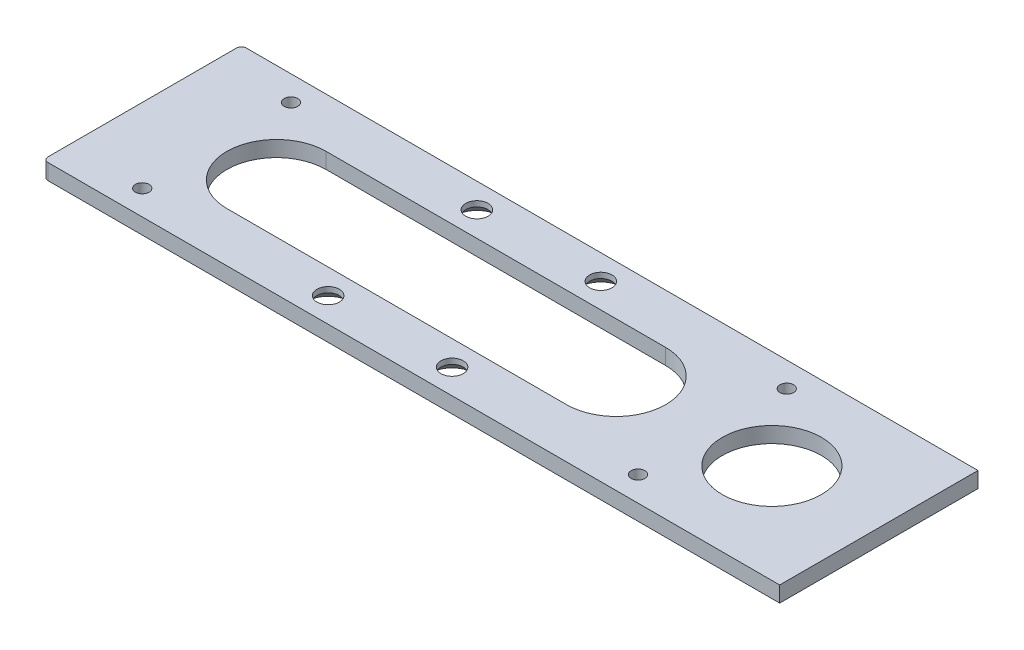
ISO-10303-21;
HEADER;
FILE_DESCRIPTION(('STEP AP214'),'2;1');
FILE_NAME('part.step','',(''),(''),'','','');
FILE_SCHEMA(('AUTOMOTIVE_DESIGN { 1 0 10303 214 1 1 1 1 }'));
ENDSEC;
DATA;
#1=APPLICATION_CONTEXT('core data for automotive mechanical design processes');
#2=APPLICATION_PROTOCOL_DEFINITION('international standard','automotive_design',2000,#1);
#3=PRODUCT_CONTEXT('',#1,'mechanical');
#4=PRODUCT('Part','Part','',(#3));
#5=PRODUCT_RELATED_PRODUCT_CATEGORY('part','',(#4));
#6=PRODUCT_DEFINITION_FORMATION('','',#4);
#7=PRODUCT_DEFINITION_CONTEXT('part definition',#1,'design');
#8=PRODUCT_DEFINITION('design','',#6,#7);
#9=PRODUCT_DEFINITION_SHAPE('','',#8);
#10=(LENGTH_UNIT() NAMED_UNIT(*) SI_UNIT(.MILLI.,.METRE.));
#11=(NAMED_UNIT(*) PLANE_ANGLE_UNIT() SI_UNIT($,.RADIAN.));
#12=(NAMED_UNIT(*) SI_UNIT($,.STERADIAN.) SOLID_ANGLE_UNIT());
#13=UNCERTAINTY_MEASURE_WITH_UNIT(LENGTH_MEASURE(1.E-05),#10,'distance_accuracy_value','');
#14=(GEOMETRIC_REPRESENTATION_CONTEXT(3) GLOBAL_UNCERTAINTY_ASSIGNED_CONTEXT((#13)) GLOBAL_UNIT_ASSIGNED_CONTEXT((#10,
#11,#12)) REPRESENTATION_CONTEXT('',''));
#15=CARTESIAN_POINT('',(0.,0.,0.));
#16=DIRECTION('',(0.,0.,1.));
#17=DIRECTION('',(1.,0.,0.));
#18=AXIS2_PLACEMENT_3D('',#15,#16,#17);
#19=CARTESIAN_POINT('',(0.,0.,0.));
#20=DIRECTION('',(0.,1.,0.));
#21=DIRECTION('',(0.,0.,1.));
#22=AXIS2_PLACEMENT_3D('',#19,#20,#21);
#23=PLANE('',#22);
#24=CARTESIAN_POINT('',(-44.7777777777778,0.,35.5555555555555));
#25=DIRECTION('',(0.,1.,0.));
#26=DIRECTION('',(0.,0.,1.));
#27=AXIS2_PLACEMENT_3D('',#24,#25,#26);
#28=CIRCLE('',#27,4.5);
#29=CARTESIAN_POINT('',(-44.7777777777778,0.,40.0555555555555));
#30=VERTEX_POINT('',#29);
#31=EDGE_CURVE('E230',#30,#30,#28,.F.);
#32=ORIENTED_EDGE('',*,*,#31,.T.);
#33=EDGE_LOOP('',(#32));
#34=FACE_BOUND('',#33,.T.);
#35=CARTESIAN_POINT('',(41.3891053094915,0.,5.55555555555554));
#36=DIRECTION('',(0.,1.,0.));
#37=DIRECTION('',(0.,0.,1.));
#38=AXIS2_PLACEMENT_3D('',#35,#36,#37);
#39=CIRCLE('',#38,20.);
#40=CARTESIAN_POINT('',(41.3891053094915,0.,25.5555555555556));
#41=VERTEX_POINT('',#40);
#42=CARTESIAN_POINT('',(41.3891053094915,0.,-14.4444444444445));
#43=VERTEX_POINT('',#42);
#44=EDGE_CURVE('E11',#41,#43,#39,.T.);
#45=ORIENTED_EDGE('',*,*,#44,.F.);
#46=DIRECTION('',(1.,0.,0.));
#47=VECTOR('',#46,1.);
#48=CARTESIAN_POINT('',(0.,0.,25.5555555555556));
#49=LINE('',#48,#47);
#50=CARTESIAN_POINT('',(-95.6280935052405,0.,25.5555555555556));
#51=VERTEX_POINT('',#50);
#52=EDGE_CURVE('E215',#51,#41,#49,.T.);
#53=ORIENTED_EDGE('',*,*,#52,.F.);
#54=CARTESIAN_POINT('',(-95.6280935052405,0.,5.55555555555556));
#55=DIRECTION('',(0.,1.,0.));
#56=DIRECTION('',(0.,0.,1.));
#57=AXIS2_PLACEMENT_3D('',#54,#55,#56);
#58=CIRCLE('',#57,20.);
#59=CARTESIAN_POINT('',(-95.6280935052405,0.,-14.4444444444445));
#60=VERTEX_POINT('',#59);
#61=EDGE_CURVE('E219',#60,#51,#58,.T.);
#62=ORIENTED_EDGE('',*,*,#61,.F.);
#63=DIRECTION('',(1.,0.,0.));
#64=VECTOR('',#63,1.);
#65=CARTESIAN_POINT('',(0.,0.,-14.4444444444445));
#66=LINE('',#65,#64);
#67=EDGE_CURVE('E48',#60,#43,#66,.T.);
#68=ORIENTED_EDGE('',*,*,#67,.T.);
#69=EDGE_LOOP('',(#45,#53,#62,#68));
#70=FACE_BOUND('',#69,.T.);
#71=CARTESIAN_POINT('',(104.209895864074,0.,5.55555555555554));
#72=DIRECTION('',(0.,1.,0.));
#73=DIRECTION('',(0.,0.,1.));
#74=AXIS2_PLACEMENT_3D('',#71,#72,#73);
#75=CIRCLE('',#74,20.);
#76=CARTESIAN_POINT('',(104.209895864074,0.,25.5555555555555));
#77=VERTEX_POINT('',#76);
#78=EDGE_CURVE('E141',#77,#77,#75,.T.);
#79=ORIENTED_EDGE('',*,*,#78,.F.);
#80=EDGE_LOOP('',(#79));
#81=FACE_BOUND('',#80,.T.);
#82=CARTESIAN_POINT('',(-119.777777777778,0.,-24.4444444444445));
#83=DIRECTION('',(0.,1.,0.));
#84=DIRECTION('',(0.,0.,1.));
#85=AXIS2_PLACEMENT_3D('',#82,#83,#84);
#86=CIRCLE('',#85,2.75);
#87=CARTESIAN_POINT('',(-119.777777777778,0.,-21.6944444444445));
#88=VERTEX_POINT('',#87);
#89=EDGE_CURVE('E146',#88,#88,#86,.T.);
#90=ORIENTED_EDGE('',*,*,#89,.F.);
#91=EDGE_LOOP('',(#90));
#92=FACE_BOUND('',#91,.T.);
#93=CARTESIAN_POINT('',(-119.777777777778,0.,35.5555555555555));
#94=DIRECTION('',(0.,1.,0.));
#95=DIRECTION('',(0.,0.,1.));
#96=AXIS2_PLACEMENT_3D('',#93,#94,#95);
#97=CIRCLE('',#96,2.75);
#98=CARTESIAN_POINT('',(-119.777777777778,0.,38.3055555555555));
#99=VERTEX_POINT('',#98);
#100=EDGE_CURVE('E152',#99,#99,#97,.T.);
#101=ORIENTED_EDGE('',*,*,#100,.F.);
#102=EDGE_LOOP('',(#101));
#103=FACE_BOUND('',#102,.T.);
#104=CARTESIAN_POINT('',(80.2222222222222,0.,35.5555555555555));
#105=DIRECTION('',(0.,1.,0.));
#106=DIRECTION('',(0.,0.,1.));
#107=AXIS2_PLACEMENT_3D('',#104,#105,#106);
#108=CIRCLE('',#107,2.75);
#109=CARTESIAN_POINT('',(80.2222222222222,0.,38.3055555555555));
#110=VERTEX_POINT('',#109);
#111=EDGE_CURVE('E158',#110,#110,#108,.T.);
#112=ORIENTED_EDGE('',*,*,#111,.F.);
#113=EDGE_LOOP('',(#112));
#114=FACE_BOUND('',#113,.T.);
#115=CARTESIAN_POINT('',(80.2222222222222,0.,-24.4444444444445));
#116=DIRECTION('',(0.,1.,0.));
#117=DIRECTION('',(0.,0.,1.));
#118=AXIS2_PLACEMENT_3D('',#115,#116,#117);
#119=CIRCLE('',#118,2.75);
#120=CARTESIAN_POINT('',(80.2222222222222,0.,-21.6944444444445));
#121=VERTEX_POINT('',#120);
#122=EDGE_CURVE('E164',#121,#121,#119,.T.);
#123=ORIENTED_EDGE('',*,*,#122,.F.);
#124=EDGE_LOOP('',(#123));
#125=FACE_BOUND('',#124,.T.);
#126=DIRECTION('',(-1.,0.,0.));
#127=VECTOR('',#126,1.);
#128=CARTESIAN_POINT('',(-149.777777777778,0.,-34.4444444444445));
#129=LINE('',#128,#127);
#130=CARTESIAN_POINT('',(147.372222222222,0.,-34.4444444444445));
#131=VERTEX_POINT('',#130);
#132=CARTESIAN_POINT('',(-147.777777777778,0.,-34.4444444444445));
#133=VERTEX_POINT('',#132);
#134=EDGE_CURVE('E175',#131,#133,#129,.T.);
#135=ORIENTED_EDGE('',*,*,#134,.T.);
#136=CARTESIAN_POINT('',(-147.777777777778,0.,-32.4444444444445));
#137=DIRECTION('',(0.,1.,0.));
#138=DIRECTION('',(0.,0.,1.));
#139=AXIS2_PLACEMENT_3D('',#136,#137,#138);
#140=CIRCLE('',#139,2.);
#141=CARTESIAN_POINT('',(-149.777777777778,0.,-32.4444444444445));
#142=VERTEX_POINT('',#141);
#143=EDGE_CURVE('E202',#133,#142,#140,.T.);
#144=ORIENTED_EDGE('',*,*,#143,.T.);
#145=DIRECTION('',(0.,0.,1.));
#146=VECTOR('',#145,1.);
#147=CARTESIAN_POINT('',(-149.777777777778,0.,-34.4444444444445));
#148=LINE('',#147,#146);
#149=CARTESIAN_POINT('',(-149.777777777778,0.,43.5555555555555));
#150=VERTEX_POINT('',#149);
#151=EDGE_CURVE('E170',#142,#150,#148,.T.);
#152=ORIENTED_EDGE('',*,*,#151,.T.);
#153=CARTESIAN_POINT('',(-147.777777777778,0.,43.5555555555555));
#154=DIRECTION('',(0.,1.,0.));
#155=DIRECTION('',(0.,0.,1.));
#156=AXIS2_PLACEMENT_3D('',#153,#154,#155);
#157=CIRCLE('',#156,2.);
#158=CARTESIAN_POINT('',(-147.777777777778,0.,45.5555555555555));
#159=VERTEX_POINT('',#158);
#160=EDGE_CURVE('E200',#150,#159,#157,.T.);
#161=ORIENTED_EDGE('',*,*,#160,.T.);
#162=DIRECTION('',(1.,0.,0.));
#163=VECTOR('',#162,1.);
#164=CARTESIAN_POINT('',(-149.777777777778,0.,45.5555555555555));
#165=LINE('',#164,#163);
#166=CARTESIAN_POINT('',(147.372222222222,0.,45.5555555555555));
#167=VERTEX_POINT('',#166);
#168=EDGE_CURVE('E186',#159,#167,#165,.T.);
#169=ORIENTED_EDGE('',*,*,#168,.T.);
#170=DIRECTION('',(0.,0.,-1.));
#171=VECTOR('',#170,1.);
#172=CARTESIAN_POINT('',(147.372222222222,0.,-34.4444444444445));
#173=LINE('',#172,#171);
#174=EDGE_CURVE('E188',#167,#131,#173,.T.);
#175=ORIENTED_EDGE('',*,*,#174,.T.);
#176=EDGE_LOOP('',(#135,#144,#152,#161,#169,#175));
#177=FACE_BOUND('',#176,.T.);
#178=CARTESIAN_POINT('',(5.22222222222219,0.,35.5555555555555));
#179=DIRECTION('',(0.,1.,0.));
#180=DIRECTION('',(0.,0.,1.));
#181=AXIS2_PLACEMENT_3D('',#178,#179,#180);
#182=CIRCLE('',#181,4.5);
#183=CARTESIAN_POINT('',(5.22222222222219,0.,40.0555555555555));
#184=VERTEX_POINT('',#183);
#185=EDGE_CURVE('E239',#184,#184,#182,.F.);
#186=ORIENTED_EDGE('',*,*,#185,.T.);
#187=EDGE_LOOP('',(#186));
#188=FACE_BOUND('',#187,.T.);
#189=CARTESIAN_POINT('',(5.22222222222225,0.,-24.4444444444445));
#190=DIRECTION('',(0.,1.,0.));
#191=DIRECTION('',(0.,0.,1.));
#192=AXIS2_PLACEMENT_3D('',#189,#190,#191);
#193=CIRCLE('',#192,4.5);
#194=CARTESIAN_POINT('',(5.22222222222225,0.,-19.9444444444445));
#195=VERTEX_POINT('',#194);
#196=EDGE_CURVE('E248',#195,#195,#193,.F.);
#197=ORIENTED_EDGE('',*,*,#196,.T.);
#198=EDGE_LOOP('',(#197));
#199=FACE_BOUND('',#198,.T.);
#200=CARTESIAN_POINT('',(-44.7777777777778,0.,-24.4444444444444));
#201=DIRECTION('',(0.,1.,0.));
#202=DIRECTION('',(0.,0.,1.));
#203=AXIS2_PLACEMENT_3D('',#200,#201,#202);
#204=CIRCLE('',#203,4.5);
#205=CARTESIAN_POINT('',(-44.7777777777778,0.,-19.9444444444445));
#206=VERTEX_POINT('',#205);
#207=EDGE_CURVE('E257',#206,#206,#204,.F.);
#208=ORIENTED_EDGE('',*,*,#207,.T.);
#209=EDGE_LOOP('',(#208));
#210=FACE_BOUND('',#209,.T.);
#211=ADVANCED_FACE('F40',(#34,#70,#81,#92,#103,#114,#125,#177,#188,#199,#210),#23,.T.);
#212=CARTESIAN_POINT('',(0.,-6.35,0.));
#213=DIRECTION('',(0.,1.,0.));
#214=DIRECTION('',(0.,0.,1.));
#215=AXIS2_PLACEMENT_3D('',#212,#213,#214);
#216=PLANE('',#215);
#217=CARTESIAN_POINT('',(-44.7777777777778,-6.35,-24.4444444444444));
#218=DIRECTION('',(0.,-1.,0.));
#219=DIRECTION('',(0.,0.,-1.));
#220=AXIS2_PLACEMENT_3D('',#217,#218,#219);
#221=CIRCLE('',#220,8.65);
#222=CARTESIAN_POINT('',(-44.7777777777778,-6.35,-33.0944444444444));
#223=VERTEX_POINT('',#222);
#224=EDGE_CURVE('E260',#223,#223,#221,.T.);
#225=ORIENTED_EDGE('',*,*,#224,.F.);
#226=EDGE_LOOP('',(#225));
#227=FACE_BOUND('',#226,.T.);
#228=CARTESIAN_POINT('',(5.22222222222225,-6.35,-24.4444444444445));
#229=DIRECTION('',(0.,-1.,0.));
#230=DIRECTION('',(0.,0.,-1.));
#231=AXIS2_PLACEMENT_3D('',#228,#229,#230);
#232=CIRCLE('',#231,8.65);
#233=CARTESIAN_POINT('',(5.22222222222225,-6.35,-33.0944444444445));
#234=VERTEX_POINT('',#233);
#235=EDGE_CURVE('E251',#234,#234,#232,.T.);
#236=ORIENTED_EDGE('',*,*,#235,.F.);
#237=EDGE_LOOP('',(#236));
#238=FACE_BOUND('',#237,.T.);
#239=CARTESIAN_POINT('',(5.22222222222219,-6.35,35.5555555555555));
#240=DIRECTION('',(0.,-1.,0.));
#241=DIRECTION('',(0.,0.,-1.));
#242=AXIS2_PLACEMENT_3D('',#239,#240,#241);
#243=CIRCLE('',#242,8.65);
#244=CARTESIAN_POINT('',(5.22222222222219,-6.35,26.9055555555555));
#245=VERTEX_POINT('',#244);
#246=EDGE_CURVE('E242',#245,#245,#243,.T.);
#247=ORIENTED_EDGE('',*,*,#246,.F.);
#248=EDGE_LOOP('',(#247));
#249=FACE_BOUND('',#248,.T.);
#250=DIRECTION('',(-1.,0.,0.));
#251=VECTOR('',#250,1.);
#252=CARTESIAN_POINT('',(41.3891053094915,-6.35,25.5555555555556));
#253=LINE('',#252,#251);
#254=CARTESIAN_POINT('',(41.3891053094915,-6.35,25.5555555555556));
#255=VERTEX_POINT('',#254);
#256=CARTESIAN_POINT('',(-95.6280935052405,-6.35,25.5555555555556));
#257=VERTEX_POINT('',#256);
#258=EDGE_CURVE('E137',#255,#257,#253,.T.);
#259=ORIENTED_EDGE('',*,*,#258,.F.);
#260=CARTESIAN_POINT('',(41.3891053094915,-6.35,5.55555555555554));
#261=DIRECTION('',(0.,-1.,0.));
#262=DIRECTION('',(0.,0.,-1.));
#263=AXIS2_PLACEMENT_3D('',#260,#261,#262);
#264=CIRCLE('',#263,20.);
#265=CARTESIAN_POINT('',(41.3891053094915,-6.35,-14.4444444444445));
#266=VERTEX_POINT('',#265);
#267=EDGE_CURVE('E55',#266,#255,#264,.T.);
#268=ORIENTED_EDGE('',*,*,#267,.F.);
#269=DIRECTION('',(-1.,0.,0.));
#270=VECTOR('',#269,1.);
#271=CARTESIAN_POINT('',(41.3891053094915,-6.35,-14.4444444444445));
#272=LINE('',#271,#270);
#273=CARTESIAN_POINT('',(-95.6280935052405,-6.35,-14.4444444444445));
#274=VERTEX_POINT('',#273);
#275=EDGE_CURVE('E125',#266,#274,#272,.T.);
#276=ORIENTED_EDGE('',*,*,#275,.T.);
#277=CARTESIAN_POINT('',(-95.6280935052405,-6.35,5.55555555555556));
#278=DIRECTION('',(0.,-1.,0.));
#279=DIRECTION('',(0.,0.,-1.));
#280=AXIS2_PLACEMENT_3D('',#277,#278,#279);
#281=CIRCLE('',#280,20.);
#282=EDGE_CURVE('E131',#257,#274,#281,.T.);
#283=ORIENTED_EDGE('',*,*,#282,.F.);
#284=EDGE_LOOP('',(#259,#268,#276,#283));
#285=FACE_BOUND('',#284,.T.);
#286=CARTESIAN_POINT('',(104.209895864074,-6.35,5.55555555555554));
#287=DIRECTION('',(0.,-1.,0.));
#288=DIRECTION('',(0.,0.,-1.));
#289=AXIS2_PLACEMENT_3D('',#286,#287,#288);
#290=CIRCLE('',#289,20.);
#291=CARTESIAN_POINT('',(104.209895864074,-6.35,-14.4444444444445));
#292=VERTEX_POINT('',#291);
#293=EDGE_CURVE('E138',#292,#292,#290,.T.);
#294=ORIENTED_EDGE('',*,*,#293,.F.);
#295=EDGE_LOOP('',(#294));
#296=FACE_BOUND('',#295,.T.);
#297=CARTESIAN_POINT('',(-119.777777777778,-6.35,-24.4444444444445));
#298=DIRECTION('',(0.,1.,0.));
#299=DIRECTION('',(0.,0.,1.));
#300=AXIS2_PLACEMENT_3D('',#297,#298,#299);
#301=CIRCLE('',#300,2.75);
#302=CARTESIAN_POINT('',(-119.777777777778,-6.35,-21.6944444444445));
#303=VERTEX_POINT('',#302);
#304=EDGE_CURVE('E149',#303,#303,#301,.T.);
#305=ORIENTED_EDGE('',*,*,#304,.T.);
#306=EDGE_LOOP('',(#305));
#307=FACE_BOUND('',#306,.T.);
#308=CARTESIAN_POINT('',(-119.777777777778,-6.35,35.5555555555555));
#309=DIRECTION('',(0.,1.,0.));
#310=DIRECTION('',(0.,0.,1.));
#311=AXIS2_PLACEMENT_3D('',#308,#309,#310);
#312=CIRCLE('',#311,2.75);
#313=CARTESIAN_POINT('',(-119.777777777778,-6.35,38.3055555555555));
#314=VERTEX_POINT('',#313);
#315=EDGE_CURVE('E155',#314,#314,#312,.T.);
#316=ORIENTED_EDGE('',*,*,#315,.T.);
#317=EDGE_LOOP('',(#316));
#318=FACE_BOUND('',#317,.T.);
#319=CARTESIAN_POINT('',(80.2222222222222,-6.35,35.5555555555555));
#320=DIRECTION('',(0.,1.,0.));
#321=DIRECTION('',(0.,0.,1.));
#322=AXIS2_PLACEMENT_3D('',#319,#320,#321);
#323=CIRCLE('',#322,2.75);
#324=CARTESIAN_POINT('',(80.2222222222222,-6.35,38.3055555555555));
#325=VERTEX_POINT('',#324);
#326=EDGE_CURVE('E161',#325,#325,#323,.T.);
#327=ORIENTED_EDGE('',*,*,#326,.T.);
#328=EDGE_LOOP('',(#327));
#329=FACE_BOUND('',#328,.T.);
#330=CARTESIAN_POINT('',(80.2222222222222,-6.35,-24.4444444444445));
#331=DIRECTION('',(0.,1.,0.));
#332=DIRECTION('',(0.,0.,1.));
#333=AXIS2_PLACEMENT_3D('',#330,#331,#332);
#334=CIRCLE('',#333,2.75);
#335=CARTESIAN_POINT('',(80.2222222222222,-6.35,-21.6944444444445));
#336=VERTEX_POINT('',#335);
#337=EDGE_CURVE('E167',#336,#336,#334,.T.);
#338=ORIENTED_EDGE('',*,*,#337,.T.);
#339=EDGE_LOOP('',(#338));
#340=FACE_BOUND('',#339,.T.);
#341=DIRECTION('',(0.,0.,1.));
#342=VECTOR('',#341,1.);
#343=CARTESIAN_POINT('',(-149.777777777778,-6.35,-34.4444444444445));
#344=LINE('',#343,#342);
#345=CARTESIAN_POINT('',(-149.777777777778,-6.35,-32.4444444444445));
#346=VERTEX_POINT('',#345);
#347=CARTESIAN_POINT('',(-149.777777777778,-6.35,43.5555555555555));
#348=VERTEX_POINT('',#347);
#349=EDGE_CURVE('E171',#346,#348,#344,.T.);
#350=ORIENTED_EDGE('',*,*,#349,.F.);
#351=CARTESIAN_POINT('',(-147.777777777778,-6.35,-32.4444444444445));
#352=DIRECTION('',(0.,1.,0.));
#353=DIRECTION('',(0.,0.,1.));
#354=AXIS2_PLACEMENT_3D('',#351,#352,#353);
#355=CIRCLE('',#354,2.);
#356=CARTESIAN_POINT('',(-147.777777777778,-6.35,-34.4444444444445));
#357=VERTEX_POINT('',#356);
#358=EDGE_CURVE('E211',#346,#357,#355,.F.);
#359=ORIENTED_EDGE('',*,*,#358,.T.);
#360=DIRECTION('',(-1.,0.,0.));
#361=VECTOR('',#360,1.);
#362=CARTESIAN_POINT('',(-149.777777777778,-6.35,-34.4444444444445));
#363=LINE('',#362,#361);
#364=CARTESIAN_POINT('',(147.372222222222,-6.35,-34.4444444444445));
#365=VERTEX_POINT('',#364);
#366=EDGE_CURVE('E180',#365,#357,#363,.T.);
#367=ORIENTED_EDGE('',*,*,#366,.F.);
#368=DIRECTION('',(0.,0.,-1.));
#369=VECTOR('',#368,1.);
#370=CARTESIAN_POINT('',(147.372222222222,-6.35,-34.4444444444445));
#371=LINE('',#370,#369);
#372=CARTESIAN_POINT('',(147.372222222222,-6.35,45.5555555555555));
#373=VERTEX_POINT('',#372);
#374=EDGE_CURVE('E177',#373,#365,#371,.T.);
#375=ORIENTED_EDGE('',*,*,#374,.F.);
#376=DIRECTION('',(1.,0.,0.));
#377=VECTOR('',#376,1.);
#378=CARTESIAN_POINT('',(-149.777777777778,-6.35,45.5555555555555));
#379=LINE('',#378,#377);
#380=CARTESIAN_POINT('',(-147.777777777778,-6.35,45.5555555555555));
#381=VERTEX_POINT('',#380);
#382=EDGE_CURVE('E174',#381,#373,#379,.T.);
#383=ORIENTED_EDGE('',*,*,#382,.F.);
#384=CARTESIAN_POINT('',(-147.777777777778,-6.35,43.5555555555555));
#385=DIRECTION('',(0.,1.,0.));
#386=DIRECTION('',(0.,0.,1.));
#387=AXIS2_PLACEMENT_3D('',#384,#385,#386);
#388=CIRCLE('',#387,2.);
#389=EDGE_CURVE('E209',#381,#348,#388,.F.);
#390=ORIENTED_EDGE('',*,*,#389,.T.);
#391=EDGE_LOOP('',(#350,#359,#367,#375,#383,#390));
#392=FACE_BOUND('',#391,.T.);
#393=CARTESIAN_POINT('',(-44.7777777777778,-6.35,35.5555555555555));
#394=DIRECTION('',(0.,-1.,0.));
#395=DIRECTION('',(0.,0.,-1.));
#396=AXIS2_PLACEMENT_3D('',#393,#394,#395);
#397=CIRCLE('',#396,8.65);
#398=CARTESIAN_POINT('',(-44.7777777777778,-6.35,26.9055555555555));
#399=VERTEX_POINT('',#398);
#400=EDGE_CURVE('E233',#399,#399,#397,.T.);
#401=ORIENTED_EDGE('',*,*,#400,.F.);
#402=EDGE_LOOP('',(#401));
#403=FACE_BOUND('',#402,.T.);
#404=ADVANCED_FACE('F135',(#227,#238,#249,#285,#296,#307,#318,#329,#340,#392,#403),#216,.F.);
#405=CARTESIAN_POINT('',(-149.777777777778,-6.35,-34.4444444444445));
#406=DIRECTION('',(-1.,0.,0.));
#407=DIRECTION('',(0.,0.,1.));
#408=AXIS2_PLACEMENT_3D('',#405,#406,#407);
#409=PLANE('',#408);
#410=ORIENTED_EDGE('',*,*,#151,.F.);
#411=DIRECTION('',(0.,1.,0.));
#412=VECTOR('',#411,1.);
#413=CARTESIAN_POINT('',(-149.777777777778,-6.35,-32.4444444444445));
#414=LINE('',#413,#412);
#415=EDGE_CURVE('E207',#142,#346,#414,.F.);
#416=ORIENTED_EDGE('',*,*,#415,.T.);
#417=ORIENTED_EDGE('',*,*,#349,.T.);
#418=DIRECTION('',(0.,1.,0.));
#419=VECTOR('',#418,1.);
#420=CARTESIAN_POINT('',(-149.777777777778,-6.35,43.5555555555555));
#421=LINE('',#420,#419);
#422=EDGE_CURVE('E204',#348,#150,#421,.T.);
#423=ORIENTED_EDGE('',*,*,#422,.T.);
#424=EDGE_LOOP('',(#410,#416,#417,#423));
#425=FACE_BOUND('',#424,.T.);
#426=ADVANCED_FACE('F276',(#425),#409,.T.);
#427=CARTESIAN_POINT('',(-149.777777777778,-6.35,-34.4444444444445));
#428=DIRECTION('',(0.,0.,-1.));
#429=DIRECTION('',(-1.,0.,0.));
#430=AXIS2_PLACEMENT_3D('',#427,#428,#429);
#431=PLANE('',#430);
#432=ORIENTED_EDGE('',*,*,#366,.T.);
#433=DIRECTION('',(0.,1.,0.));
#434=VECTOR('',#433,1.);
#435=CARTESIAN_POINT('',(-147.777777777778,-6.35,-34.4444444444445));
#436=LINE('',#435,#434);
#437=EDGE_CURVE('E195',#357,#133,#436,.T.);
#438=ORIENTED_EDGE('',*,*,#437,.T.);
#439=ORIENTED_EDGE('',*,*,#134,.F.);
#440=DIRECTION('',(0.,1.,0.));
#441=VECTOR('',#440,1.);
#442=CARTESIAN_POINT('',(147.372222222222,-6.35,-34.4444444444445));
#443=LINE('',#442,#441);
#444=EDGE_CURVE('E193',#365,#131,#443,.T.);
#445=ORIENTED_EDGE('',*,*,#444,.F.);
#446=EDGE_LOOP('',(#432,#438,#439,#445));
#447=FACE_BOUND('',#446,.T.);
#448=ADVANCED_FACE('F307',(#447),#431,.T.);
#449=CARTESIAN_POINT('',(147.372222222222,-6.35,-34.4444444444445));
#450=DIRECTION('',(1.,0.,0.));
#451=DIRECTION('',(0.,0.,-1.));
#452=AXIS2_PLACEMENT_3D('',#449,#450,#451);
#453=PLANE('',#452);
#454=ORIENTED_EDGE('',*,*,#174,.F.);
#455=DIRECTION('',(0.,1.,0.));
#456=VECTOR('',#455,1.);
#457=CARTESIAN_POINT('',(147.372222222222,-6.35,45.5555555555555));
#458=LINE('',#457,#456);
#459=EDGE_CURVE('E183',#373,#167,#458,.T.);
#460=ORIENTED_EDGE('',*,*,#459,.F.);
#461=ORIENTED_EDGE('',*,*,#374,.T.);
#462=ORIENTED_EDGE('',*,*,#444,.T.);
#463=EDGE_LOOP('',(#454,#460,#461,#462));
#464=FACE_BOUND('',#463,.T.);
#465=ADVANCED_FACE('F310',(#464),#453,.T.);
#466=CARTESIAN_POINT('',(-149.777777777778,-6.35,45.5555555555555));
#467=DIRECTION('',(0.,0.,1.));
#468=DIRECTION('',(1.,0.,0.));
#469=AXIS2_PLACEMENT_3D('',#466,#467,#468);
#470=PLANE('',#469);
#471=ORIENTED_EDGE('',*,*,#168,.F.);
#472=DIRECTION('',(0.,1.,0.));
#473=VECTOR('',#472,1.);
#474=CARTESIAN_POINT('',(-147.777777777778,-6.35,45.5555555555555));
#475=LINE('',#474,#473);
#476=EDGE_CURVE('E213',#159,#381,#475,.F.);
#477=ORIENTED_EDGE('',*,*,#476,.T.);
#478=ORIENTED_EDGE('',*,*,#382,.T.);
#479=ORIENTED_EDGE('',*,*,#459,.T.);
#480=EDGE_LOOP('',(#471,#477,#478,#479));
#481=FACE_BOUND('',#480,.T.);
#482=ADVANCED_FACE('F314',(#481),#470,.T.);
#483=CARTESIAN_POINT('',(-147.777777777778,-6.35,-32.4444444444445));
#484=DIRECTION('',(0.,1.,0.));
#485=DIRECTION('',(0.,0.,1.));
#486=AXIS2_PLACEMENT_3D('',#483,#484,#485);
#487=CYLINDRICAL_SURFACE('',#486,2.);
#488=ORIENTED_EDGE('',*,*,#358,.F.);
#489=ORIENTED_EDGE('',*,*,#415,.F.);
#490=ORIENTED_EDGE('',*,*,#143,.F.);
#491=ORIENTED_EDGE('',*,*,#437,.F.);
#492=EDGE_LOOP('',(#488,#489,#490,#491));
#493=FACE_BOUND('',#492,.T.);
#494=ADVANCED_FACE('F318',(#493),#487,.T.);
#495=CARTESIAN_POINT('',(-147.777777777778,-6.35,43.5555555555555));
#496=DIRECTION('',(0.,1.,0.));
#497=DIRECTION('',(0.,0.,1.));
#498=AXIS2_PLACEMENT_3D('',#495,#496,#497);
#499=CYLINDRICAL_SURFACE('',#498,2.);
#500=ORIENTED_EDGE('',*,*,#389,.F.);
#501=ORIENTED_EDGE('',*,*,#476,.F.);
#502=ORIENTED_EDGE('',*,*,#160,.F.);
#503=ORIENTED_EDGE('',*,*,#422,.F.);
#504=EDGE_LOOP('',(#500,#501,#502,#503));
#505=FACE_BOUND('',#504,.T.);
#506=ADVANCED_FACE('F42',(#505),#499,.T.);
#507=CARTESIAN_POINT('',(80.2222222222222,0.,-24.4444444444445));
#508=DIRECTION('',(0.,1.,0.));
#509=DIRECTION('',(0.,0.,1.));
#510=AXIS2_PLACEMENT_3D('',#507,#508,#509);
#511=CYLINDRICAL_SURFACE('',#510,2.75);
#512=ORIENTED_EDGE('',*,*,#337,.F.);
#513=EDGE_LOOP('',(#512));
#514=FACE_BOUND('',#513,.T.);
#515=ORIENTED_EDGE('',*,*,#122,.T.);
#516=EDGE_LOOP('',(#515));
#517=FACE_BOUND('',#516,.T.);
#518=ADVANCED_FACE('F327',(#514,#517),#511,.F.);
#519=CARTESIAN_POINT('',(80.2222222222222,0.,35.5555555555555));
#520=DIRECTION('',(0.,1.,0.));
#521=DIRECTION('',(0.,0.,1.));
#522=AXIS2_PLACEMENT_3D('',#519,#520,#521);
#523=CYLINDRICAL_SURFACE('',#522,2.75);
#524=ORIENTED_EDGE('',*,*,#326,.F.);
#525=EDGE_LOOP('',(#524));
#526=FACE_BOUND('',#525,.T.);
#527=ORIENTED_EDGE('',*,*,#111,.T.);
#528=EDGE_LOOP('',(#527));
#529=FACE_BOUND('',#528,.T.);
#530=ADVANCED_FACE('F477',(#526,#529),#523,.F.);
#531=CARTESIAN_POINT('',(-119.777777777778,0.,35.5555555555555));
#532=DIRECTION('',(0.,1.,0.));
#533=DIRECTION('',(0.,0.,1.));
#534=AXIS2_PLACEMENT_3D('',#531,#532,#533);
#535=CYLINDRICAL_SURFACE('',#534,2.75);
#536=ORIENTED_EDGE('',*,*,#315,.F.);
#537=EDGE_LOOP('',(#536));
#538=FACE_BOUND('',#537,.T.);
#539=ORIENTED_EDGE('',*,*,#100,.T.);
#540=EDGE_LOOP('',(#539));
#541=FACE_BOUND('',#540,.T.);
#542=ADVANCED_FACE('F467',(#538,#541),#535,.F.);
#543=CARTESIAN_POINT('',(-119.777777777778,0.,-24.4444444444445));
#544=DIRECTION('',(0.,1.,0.));
#545=DIRECTION('',(0.,0.,1.));
#546=AXIS2_PLACEMENT_3D('',#543,#544,#545);
#547=CYLINDRICAL_SURFACE('',#546,2.75);
#548=ORIENTED_EDGE('',*,*,#304,.F.);
#549=EDGE_LOOP('',(#548));
#550=FACE_BOUND('',#549,.T.);
#551=ORIENTED_EDGE('',*,*,#89,.T.);
#552=EDGE_LOOP('',(#551));
#553=FACE_BOUND('',#552,.T.);
#554=ADVANCED_FACE('F456',(#550,#553),#547,.F.);
#555=CARTESIAN_POINT('',(104.209895864074,3.65,5.55555555555554));
#556=DIRECTION('',(0.,-1.,0.));
#557=DIRECTION('',(0.,0.,-1.));
#558=AXIS2_PLACEMENT_3D('',#555,#556,#557);
#559=CYLINDRICAL_SURFACE('',#558,20.);
#560=ORIENTED_EDGE('',*,*,#78,.T.);
#561=EDGE_LOOP('',(#560));
#562=FACE_BOUND('',#561,.T.);
#563=ORIENTED_EDGE('',*,*,#293,.T.);
#564=EDGE_LOOP('',(#563));
#565=FACE_BOUND('',#564,.T.);
#566=ADVANCED_FACE('F446',(#562,#565),#559,.F.);
#567=CARTESIAN_POINT('',(41.3891053094915,3.65,5.55555555555554));
#568=DIRECTION('',(0.,-1.,0.));
#569=DIRECTION('',(0.,0.,-1.));
#570=AXIS2_PLACEMENT_3D('',#567,#568,#569);
#571=CYLINDRICAL_SURFACE('',#570,20.);
#572=ORIENTED_EDGE('',*,*,#44,.T.);
#573=DIRECTION('',(0.,-1.,0.));
#574=VECTOR('',#573,1.);
#575=CARTESIAN_POINT('',(41.3891053094915,3.65,-14.4444444444445));
#576=LINE('',#575,#574);
#577=EDGE_CURVE('E115',#43,#266,#576,.T.);
#578=ORIENTED_EDGE('',*,*,#577,.T.);
#579=ORIENTED_EDGE('',*,*,#267,.T.);
#580=DIRECTION('',(0.,-1.,0.));
#581=VECTOR('',#580,1.);
#582=CARTESIAN_POINT('',(41.3891053094915,3.65,25.5555555555556));
#583=LINE('',#582,#581);
#584=EDGE_CURVE('E132',#41,#255,#583,.T.);
#585=ORIENTED_EDGE('',*,*,#584,.F.);
#586=EDGE_LOOP('',(#572,#578,#579,#585));
#587=FACE_BOUND('',#586,.T.);
#588=ADVANCED_FACE('F117',(#587),#571,.F.);
#589=CARTESIAN_POINT('',(41.3891053094915,3.65,-14.4444444444445));
#590=DIRECTION('',(0.,0.,1.));
#591=DIRECTION('',(1.,0.,0.));
#592=AXIS2_PLACEMENT_3D('',#589,#590,#591);
#593=PLANE('',#592);
#594=DIRECTION('',(0.,-1.,0.));
#595=VECTOR('',#594,1.);
#596=CARTESIAN_POINT('',(-95.6280935052405,3.65,-14.4444444444445));
#597=LINE('',#596,#595);
#598=EDGE_CURVE('E121',#60,#274,#597,.T.);
#599=ORIENTED_EDGE('',*,*,#598,.T.);
#600=ORIENTED_EDGE('',*,*,#275,.F.);
#601=ORIENTED_EDGE('',*,*,#577,.F.);
#602=ORIENTED_EDGE('',*,*,#67,.F.);
#603=EDGE_LOOP('',(#599,#600,#601,#602));
#604=FACE_BOUND('',#603,.T.);
#605=ADVANCED_FACE('F126',(#604),#593,.T.);
#606=CARTESIAN_POINT('',(-95.6280935052405,3.65,5.55555555555556));
#607=DIRECTION('',(0.,-1.,0.));
#608=DIRECTION('',(0.,0.,-1.));
#609=AXIS2_PLACEMENT_3D('',#606,#607,#608);
#610=CYLINDRICAL_SURFACE('',#609,20.);
#611=ORIENTED_EDGE('',*,*,#61,.T.);
#612=DIRECTION('',(0.,-1.,0.));
#613=VECTOR('',#612,1.);
#614=CARTESIAN_POINT('',(-95.6280935052405,3.65,25.5555555555556));
#615=LINE('',#614,#613);
#616=EDGE_CURVE('E63',#51,#257,#615,.T.);
#617=ORIENTED_EDGE('',*,*,#616,.T.);
#618=ORIENTED_EDGE('',*,*,#282,.T.);
#619=ORIENTED_EDGE('',*,*,#598,.F.);
#620=EDGE_LOOP('',(#611,#617,#618,#619));
#621=FACE_BOUND('',#620,.T.);
#622=ADVANCED_FACE('F225',(#621),#610,.F.);
#623=CARTESIAN_POINT('',(41.3891053094915,3.65,25.5555555555556));
#624=DIRECTION('',(0.,0.,1.));
#625=DIRECTION('',(1.,0.,0.));
#626=AXIS2_PLACEMENT_3D('',#623,#624,#625);
#627=PLANE('',#626);
#628=ORIENTED_EDGE('',*,*,#52,.T.);
#629=ORIENTED_EDGE('',*,*,#584,.T.);
#630=ORIENTED_EDGE('',*,*,#258,.T.);
#631=ORIENTED_EDGE('',*,*,#616,.F.);
#632=EDGE_LOOP('',(#628,#629,#630,#631));
#633=FACE_BOUND('',#632,.T.);
#634=ADVANCED_FACE('F399',(#633),#627,.F.);
#635=CARTESIAN_POINT('',(-44.7777777777778,-6.35,35.5555555555555));
#636=DIRECTION('',(0.,-1.,0.));
#637=DIRECTION('',(0.,0.,-1.));
#638=AXIS2_PLACEMENT_3D('',#635,#636,#637);
#639=CYLINDRICAL_SURFACE('',#638,4.5);
#640=ORIENTED_EDGE('',*,*,#31,.F.);
#641=EDGE_LOOP('',(#640));
#642=FACE_BOUND('',#641,.T.);
#643=CARTESIAN_POINT('',(-44.7777777777778,-2.2,35.5555555555555));
#644=DIRECTION('',(0.,-1.,0.));
#645=DIRECTION('',(0.,0.,-1.));
#646=AXIS2_PLACEMENT_3D('',#643,#644,#645);
#647=CIRCLE('',#646,4.5);
#648=CARTESIAN_POINT('',(-44.7777777777778,-2.2,31.0555555555555));
#649=VERTEX_POINT('',#648);
#650=EDGE_CURVE('E122',#649,#649,#647,.T.);
#651=ORIENTED_EDGE('',*,*,#650,.T.);
#652=EDGE_LOOP('',(#651));
#653=FACE_BOUND('',#652,.T.);
#654=ADVANCED_FACE('F389',(#642,#653),#639,.F.);
#655=CARTESIAN_POINT('',(-44.7777777777778,-6.35,35.5555555555555));
#656=DIRECTION('',(0.,-1.,0.));
#657=DIRECTION('',(0.,0.,-1.));
#658=AXIS2_PLACEMENT_3D('',#655,#656,#657);
#659=CONICAL_SURFACE('',#658,8.65,0.785398163397449);
#660=ORIENTED_EDGE('',*,*,#650,.F.);
#661=EDGE_LOOP('',(#660));
#662=FACE_BOUND('',#661,.T.);
#663=ORIENTED_EDGE('',*,*,#400,.T.);
#664=EDGE_LOOP('',(#663));
#665=FACE_BOUND('',#664,.T.);
#666=ADVANCED_FACE('F295',(#662,#665),#659,.F.);
#667=CARTESIAN_POINT('',(5.22222222222219,-6.35,35.5555555555555));
#668=DIRECTION('',(0.,-1.,0.));
#669=DIRECTION('',(0.,0.,-1.));
#670=AXIS2_PLACEMENT_3D('',#667,#668,#669);
#671=CYLINDRICAL_SURFACE('',#670,4.5);
#672=ORIENTED_EDGE('',*,*,#185,.F.);
#673=EDGE_LOOP('',(#672));
#674=FACE_BOUND('',#673,.T.);
#675=CARTESIAN_POINT('',(5.22222222222219,-2.2,35.5555555555555));
#676=DIRECTION('',(0.,-1.,0.));
#677=DIRECTION('',(0.,0.,-1.));
#678=AXIS2_PLACEMENT_3D('',#675,#676,#677);
#679=CIRCLE('',#678,4.5);
#680=CARTESIAN_POINT('',(5.22222222222219,-2.2,31.0555555555555));
#681=VERTEX_POINT('',#680);
#682=EDGE_CURVE('E236',#681,#681,#679,.T.);
#683=ORIENTED_EDGE('',*,*,#682,.T.);
#684=EDGE_LOOP('',(#683));
#685=FACE_BOUND('',#684,.T.);
#686=ADVANCED_FACE('F285',(#674,#685),#671,.F.);
#687=CARTESIAN_POINT('',(5.22222222222219,-6.35,35.5555555555555));
#688=DIRECTION('',(0.,-1.,0.));
#689=DIRECTION('',(0.,0.,-1.));
#690=AXIS2_PLACEMENT_3D('',#687,#688,#689);
#691=CONICAL_SURFACE('',#690,8.65,0.785398163397449);
#692=ORIENTED_EDGE('',*,*,#682,.F.);
#693=EDGE_LOOP('',(#692));
#694=FACE_BOUND('',#693,.T.);
#695=ORIENTED_EDGE('',*,*,#246,.T.);
#696=EDGE_LOOP('',(#695));
#697=FACE_BOUND('',#696,.T.);
#698=ADVANCED_FACE('F282',(#694,#697),#691,.F.);
#699=CARTESIAN_POINT('',(5.22222222222225,-6.35,-24.4444444444445));
#700=DIRECTION('',(0.,-1.,0.));
#701=DIRECTION('',(0.,0.,-1.));
#702=AXIS2_PLACEMENT_3D('',#699,#700,#701);
#703=CYLINDRICAL_SURFACE('',#702,4.5);
#704=ORIENTED_EDGE('',*,*,#196,.F.);
#705=EDGE_LOOP('',(#704));
#706=FACE_BOUND('',#705,.T.);
#707=CARTESIAN_POINT('',(5.22222222222225,-2.2,-24.4444444444445));
#708=DIRECTION('',(0.,-1.,0.));
#709=DIRECTION('',(0.,0.,-1.));
#710=AXIS2_PLACEMENT_3D('',#707,#708,#709);
#711=CIRCLE('',#710,4.5);
#712=CARTESIAN_POINT('',(5.22222222222225,-2.2,-28.9444444444445));
#713=VERTEX_POINT('',#712);
#714=EDGE_CURVE('E245',#713,#713,#711,.T.);
#715=ORIENTED_EDGE('',*,*,#714,.T.);
#716=EDGE_LOOP('',(#715));
#717=FACE_BOUND('',#716,.T.);
#718=ADVANCED_FACE('F284',(#706,#717),#703,.F.);
#719=CARTESIAN_POINT('',(5.22222222222225,-6.35,-24.4444444444445));
#720=DIRECTION('',(0.,-1.,0.));
#721=DIRECTION('',(0.,0.,-1.));
#722=AXIS2_PLACEMENT_3D('',#719,#720,#721);
#723=CONICAL_SURFACE('',#722,8.65,0.785398163397449);
#724=ORIENTED_EDGE('',*,*,#714,.F.);
#725=EDGE_LOOP('',(#724));
#726=FACE_BOUND('',#725,.T.);
#727=ORIENTED_EDGE('',*,*,#235,.T.);
#728=EDGE_LOOP('',(#727));
#729=FACE_BOUND('',#728,.T.);
#730=ADVANCED_FACE('F292',(#726,#729),#723,.F.);
#731=CARTESIAN_POINT('',(-44.7777777777778,-6.35,-24.4444444444444));
#732=DIRECTION('',(0.,-1.,0.));
#733=DIRECTION('',(0.,0.,-1.));
#734=AXIS2_PLACEMENT_3D('',#731,#732,#733);
#735=CYLINDRICAL_SURFACE('',#734,4.5);
#736=ORIENTED_EDGE('',*,*,#207,.F.);
#737=EDGE_LOOP('',(#736));
#738=FACE_BOUND('',#737,.T.);
#739=CARTESIAN_POINT('',(-44.7777777777778,-2.2,-24.4444444444444));
#740=DIRECTION('',(0.,-1.,0.));
#741=DIRECTION('',(0.,0.,-1.));
#742=AXIS2_PLACEMENT_3D('',#739,#740,#741);
#743=CIRCLE('',#742,4.5);
#744=CARTESIAN_POINT('',(-44.7777777777778,-2.2,-28.9444444444444));
#745=VERTEX_POINT('',#744);
#746=EDGE_CURVE('E254',#745,#745,#743,.T.);
#747=ORIENTED_EDGE('',*,*,#746,.T.);
#748=EDGE_LOOP('',(#747));
#749=FACE_BOUND('',#748,.T.);
#750=ADVANCED_FACE('F266',(#738,#749),#735,.F.);
#751=CARTESIAN_POINT('',(-44.7777777777778,-6.35,-24.4444444444444));
#752=DIRECTION('',(0.,-1.,0.));
#753=DIRECTION('',(0.,0.,-1.));
#754=AXIS2_PLACEMENT_3D('',#751,#752,#753);
#755=CONICAL_SURFACE('',#754,8.65,0.785398163397449);
#756=ORIENTED_EDGE('',*,*,#746,.F.);
#757=EDGE_LOOP('',(#756));
#758=FACE_BOUND('',#757,.T.);
#759=ORIENTED_EDGE('',*,*,#224,.T.);
#760=EDGE_LOOP('',(#759));
#761=FACE_BOUND('',#760,.T.);
#762=ADVANCED_FACE('F268',(#758,#761),#755,.F.);
#763=CLOSED_SHELL('',(#211,#404,#426,#448,#465,#482,#494,#506,#518,#530,#542,#554,#566,#588,
#605,#622,#634,#654,#666,#686,#698,#718,#730,#750,#762));
#764=MANIFOLD_SOLID_BREP('B2',#763);
#765=ADVANCED_BREP_SHAPE_REPRESENTATION('',(#18,#764),#14);
#766=SHAPE_DEFINITION_REPRESENTATION(#9,#765);
ENDSEC;
END-ISO-10303-21;
